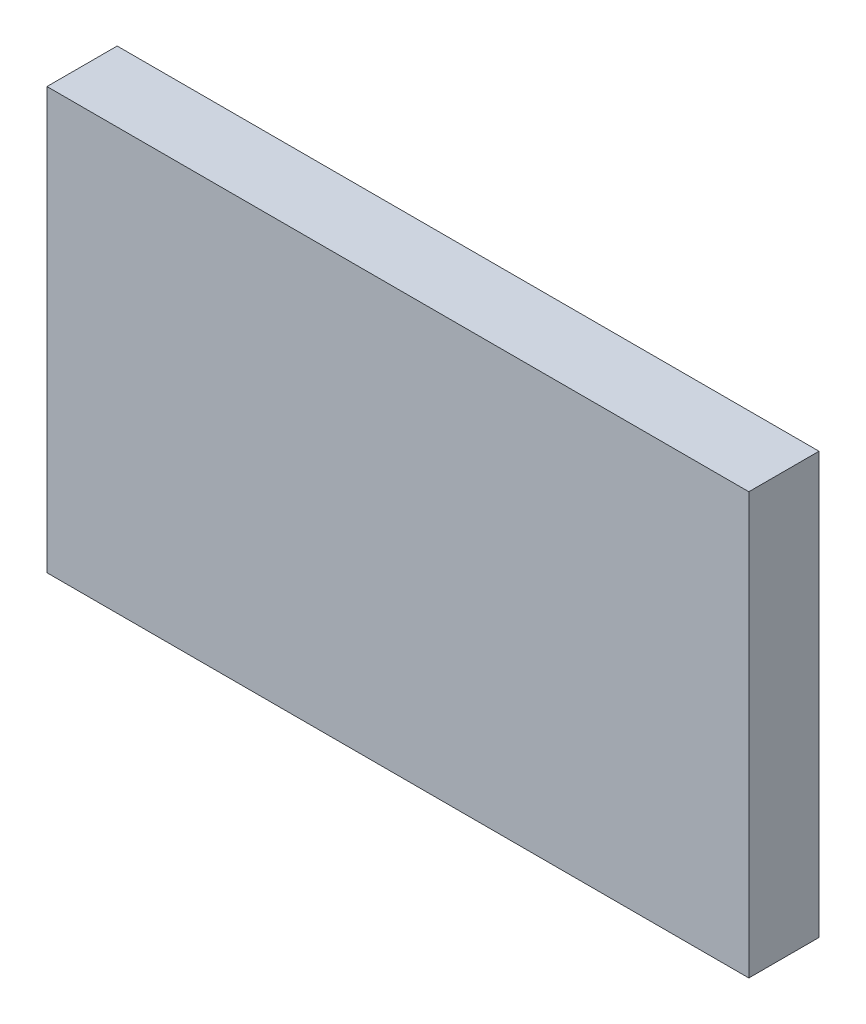
ISO-10303-21;
HEADER;
FILE_DESCRIPTION(('STEP AP214'),'2;1');
FILE_NAME('part.step','',(''),(''),'','','');
FILE_SCHEMA(('AUTOMOTIVE_DESIGN { 1 0 10303 214 1 1 1 1 }'));
ENDSEC;
DATA;
#1=APPLICATION_CONTEXT('core data for automotive mechanical design processes');
#2=APPLICATION_PROTOCOL_DEFINITION('international standard','automotive_design',2000,#1);
#3=PRODUCT_CONTEXT('',#1,'mechanical');
#4=PRODUCT('Part','Part','',(#3));
#5=PRODUCT_RELATED_PRODUCT_CATEGORY('part','',(#4));
#6=PRODUCT_DEFINITION_FORMATION('','',#4);
#7=PRODUCT_DEFINITION_CONTEXT('part definition',#1,'design');
#8=PRODUCT_DEFINITION('design','',#6,#7);
#9=PRODUCT_DEFINITION_SHAPE('','',#8);
#10=(LENGTH_UNIT() NAMED_UNIT(*) SI_UNIT(.MILLI.,.METRE.));
#11=(NAMED_UNIT(*) PLANE_ANGLE_UNIT() SI_UNIT($,.RADIAN.));
#12=(NAMED_UNIT(*) SI_UNIT($,.STERADIAN.) SOLID_ANGLE_UNIT());
#13=UNCERTAINTY_MEASURE_WITH_UNIT(LENGTH_MEASURE(1.E-05),#10,'distance_accuracy_value','');
#14=(GEOMETRIC_REPRESENTATION_CONTEXT(3) GLOBAL_UNCERTAINTY_ASSIGNED_CONTEXT((#13)) GLOBAL_UNIT_ASSIGNED_CONTEXT((#10,
#11,#12)) REPRESENTATION_CONTEXT('',''));
#15=CARTESIAN_POINT('',(0.,0.,0.));
#16=DIRECTION('',(0.,0.,1.));
#17=DIRECTION('',(1.,0.,0.));
#18=AXIS2_PLACEMENT_3D('',#15,#16,#17);
#19=CARTESIAN_POINT('',(0.,0.,2.));
#20=DIRECTION('',(0.,-1.,0.));
#21=DIRECTION('',(0.,0.,-1.));
#22=AXIS2_PLACEMENT_3D('',#19,#20,#21);
#23=PLANE('',#22);
#24=DIRECTION('',(-1.,0.,0.));
#25=VECTOR('',#24,1.);
#26=CARTESIAN_POINT('',(0.,0.,0.));
#27=LINE('',#26,#25);
#28=CARTESIAN_POINT('',(20.,0.,0.));
#29=VERTEX_POINT('',#28);
#30=CARTESIAN_POINT('',(0.,0.,0.));
#31=VERTEX_POINT('',#30);
#32=EDGE_CURVE('E98',#29,#31,#27,.T.);
#33=ORIENTED_EDGE('',*,*,#32,.F.);
#34=DIRECTION('',(0.,0.,-1.));
#35=VECTOR('',#34,1.);
#36=CARTESIAN_POINT('',(20.,0.,2.));
#37=LINE('',#36,#35);
#38=CARTESIAN_POINT('',(20.,0.,2.));
#39=VERTEX_POINT('',#38);
#40=EDGE_CURVE('E11',#39,#29,#37,.T.);
#41=ORIENTED_EDGE('',*,*,#40,.F.);
#42=DIRECTION('',(-1.,0.,0.));
#43=VECTOR('',#42,1.);
#44=CARTESIAN_POINT('',(0.,0.,2.));
#45=LINE('',#44,#43);
#46=CARTESIAN_POINT('',(0.,0.,2.));
#47=VERTEX_POINT('',#46);
#48=EDGE_CURVE('E83',#39,#47,#45,.T.);
#49=ORIENTED_EDGE('',*,*,#48,.T.);
#50=DIRECTION('',(0.,0.,-1.));
#51=VECTOR('',#50,1.);
#52=CARTESIAN_POINT('',(0.,0.,2.));
#53=LINE('',#52,#51);
#54=EDGE_CURVE('E51',#47,#31,#53,.T.);
#55=ORIENTED_EDGE('',*,*,#54,.T.);
#56=EDGE_LOOP('',(#33,#41,#49,#55));
#57=FACE_BOUND('',#56,.T.);
#58=ADVANCED_FACE('F35',(#57),#23,.T.);
#59=CARTESIAN_POINT('',(20.,0.,2.));
#60=DIRECTION('',(-1.,0.,0.));
#61=DIRECTION('',(0.,0.,1.));
#62=AXIS2_PLACEMENT_3D('',#59,#60,#61);
#63=PLANE('',#62);
#64=DIRECTION('',(0.,1.,0.));
#65=VECTOR('',#64,1.);
#66=CARTESIAN_POINT('',(20.,0.,0.));
#67=LINE('',#66,#65);
#68=CARTESIAN_POINT('',(20.,12.,0.));
#69=VERTEX_POINT('',#68);
#70=EDGE_CURVE('E89',#29,#69,#67,.T.);
#71=ORIENTED_EDGE('',*,*,#70,.T.);
#72=DIRECTION('',(0.,0.,-1.));
#73=VECTOR('',#72,1.);
#74=CARTESIAN_POINT('',(20.,12.,2.));
#75=LINE('',#74,#73);
#76=CARTESIAN_POINT('',(20.,12.,2.));
#77=VERTEX_POINT('',#76);
#78=EDGE_CURVE('E43',#77,#69,#75,.T.);
#79=ORIENTED_EDGE('',*,*,#78,.F.);
#80=DIRECTION('',(0.,1.,0.));
#81=VECTOR('',#80,1.);
#82=CARTESIAN_POINT('',(20.,0.,2.));
#83=LINE('',#82,#81);
#84=EDGE_CURVE('E77',#39,#77,#83,.T.);
#85=ORIENTED_EDGE('',*,*,#84,.F.);
#86=ORIENTED_EDGE('',*,*,#40,.T.);
#87=EDGE_LOOP('',(#71,#79,#85,#86));
#88=FACE_BOUND('',#87,.T.);
#89=ADVANCED_FACE('F87',(#88),#63,.F.);
#90=CARTESIAN_POINT('',(0.,12.,2.));
#91=DIRECTION('',(0.,-1.,0.));
#92=DIRECTION('',(0.,0.,-1.));
#93=AXIS2_PLACEMENT_3D('',#90,#91,#92);
#94=PLANE('',#93);
#95=DIRECTION('',(-1.,0.,0.));
#96=VECTOR('',#95,1.);
#97=CARTESIAN_POINT('',(0.,12.,0.));
#98=LINE('',#97,#96);
#99=CARTESIAN_POINT('',(0.,12.,0.));
#100=VERTEX_POINT('',#99);
#101=EDGE_CURVE('E101',#69,#100,#98,.T.);
#102=ORIENTED_EDGE('',*,*,#101,.T.);
#103=DIRECTION('',(0.,0.,-1.));
#104=VECTOR('',#103,1.);
#105=CARTESIAN_POINT('',(0.,12.,2.));
#106=LINE('',#105,#104);
#107=CARTESIAN_POINT('',(0.,12.,2.));
#108=VERTEX_POINT('',#107);
#109=EDGE_CURVE('E65',#108,#100,#106,.T.);
#110=ORIENTED_EDGE('',*,*,#109,.F.);
#111=DIRECTION('',(-1.,0.,0.));
#112=VECTOR('',#111,1.);
#113=CARTESIAN_POINT('',(0.,12.,2.));
#114=LINE('',#113,#112);
#115=EDGE_CURVE('E82',#77,#108,#114,.T.);
#116=ORIENTED_EDGE('',*,*,#115,.F.);
#117=ORIENTED_EDGE('',*,*,#78,.T.);
#118=EDGE_LOOP('',(#102,#110,#116,#117));
#119=FACE_BOUND('',#118,.T.);
#120=ADVANCED_FACE('F92',(#119),#94,.F.);
#121=CARTESIAN_POINT('',(0.,0.,2.));
#122=DIRECTION('',(-1.,0.,0.));
#123=DIRECTION('',(0.,0.,1.));
#124=AXIS2_PLACEMENT_3D('',#121,#122,#123);
#125=PLANE('',#124);
#126=DIRECTION('',(0.,1.,0.));
#127=VECTOR('',#126,1.);
#128=CARTESIAN_POINT('',(0.,0.,0.));
#129=LINE('',#128,#127);
#130=EDGE_CURVE('E103',#31,#100,#129,.T.);
#131=ORIENTED_EDGE('',*,*,#130,.F.);
#132=ORIENTED_EDGE('',*,*,#54,.F.);
#133=DIRECTION('',(0.,1.,0.));
#134=VECTOR('',#133,1.);
#135=CARTESIAN_POINT('',(0.,0.,2.));
#136=LINE('',#135,#134);
#137=EDGE_CURVE('E93',#47,#108,#136,.T.);
#138=ORIENTED_EDGE('',*,*,#137,.T.);
#139=ORIENTED_EDGE('',*,*,#109,.T.);
#140=EDGE_LOOP('',(#131,#132,#138,#139));
#141=FACE_BOUND('',#140,.T.);
#142=ADVANCED_FACE('F108',(#141),#125,.T.);
#143=CARTESIAN_POINT('',(0.,0.,2.));
#144=DIRECTION('',(0.,0.,1.));
#145=DIRECTION('',(1.,0.,0.));
#146=AXIS2_PLACEMENT_3D('',#143,#144,#145);
#147=PLANE('',#146);
#148=ORIENTED_EDGE('',*,*,#48,.F.);
#149=ORIENTED_EDGE('',*,*,#84,.T.);
#150=ORIENTED_EDGE('',*,*,#115,.T.);
#151=ORIENTED_EDGE('',*,*,#137,.F.);
#152=EDGE_LOOP('',(#148,#149,#150,#151));
#153=FACE_BOUND('',#152,.T.);
#154=ADVANCED_FACE('F79',(#153),#147,.T.);
#155=CARTESIAN_POINT('',(0.,0.,0.));
#156=DIRECTION('',(0.,0.,1.));
#157=DIRECTION('',(1.,0.,0.));
#158=AXIS2_PLACEMENT_3D('',#155,#156,#157);
#159=PLANE('',#158);
#160=ORIENTED_EDGE('',*,*,#32,.T.);
#161=ORIENTED_EDGE('',*,*,#130,.T.);
#162=ORIENTED_EDGE('',*,*,#101,.F.);
#163=ORIENTED_EDGE('',*,*,#70,.F.);
#164=EDGE_LOOP('',(#160,#161,#162,#163));
#165=FACE_BOUND('',#164,.T.);
#166=ADVANCED_FACE('F115',(#165),#159,.F.);
#167=CLOSED_SHELL('',(#58,#89,#120,#142,#154,#166));
#168=MANIFOLD_SOLID_BREP('B2',#167);
#169=ADVANCED_BREP_SHAPE_REPRESENTATION('',(#18,#168),#14);
#170=SHAPE_DEFINITION_REPRESENTATION(#9,#169);
ENDSEC;
END-ISO-10303-21;
